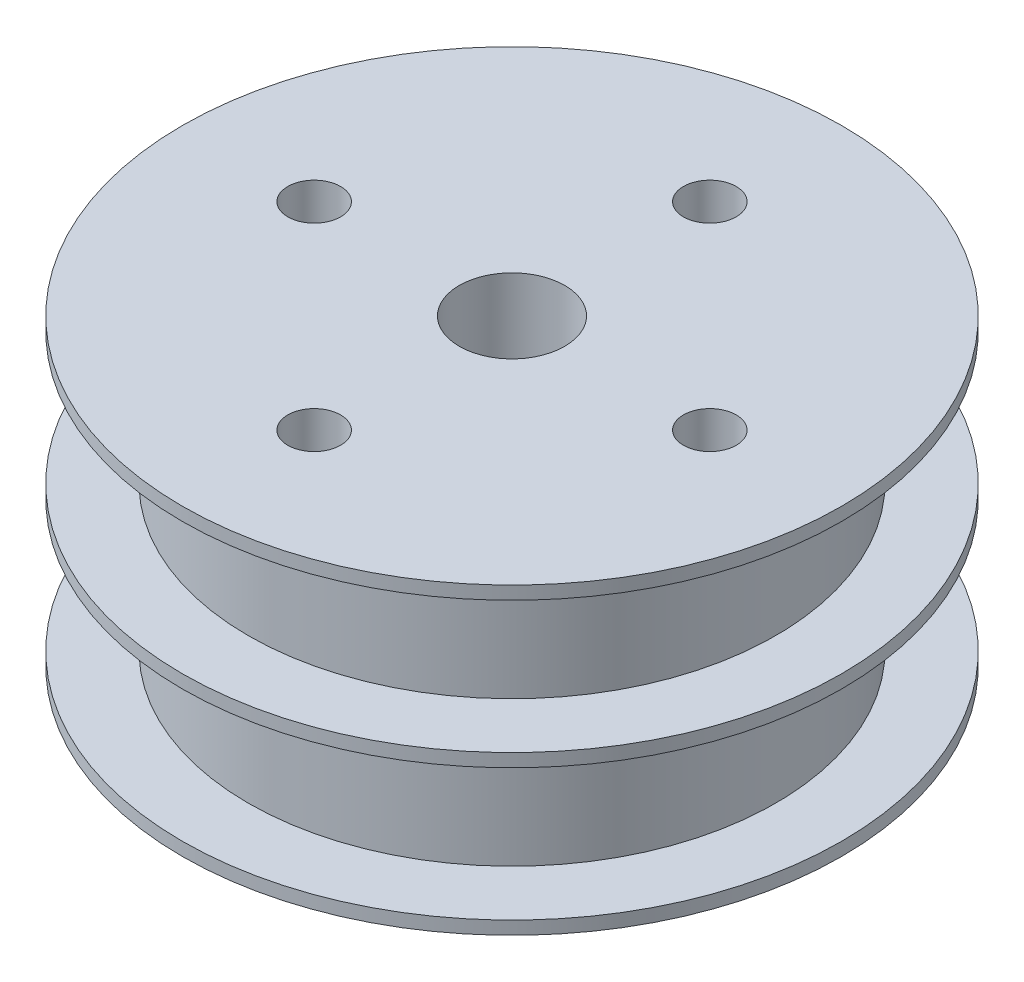
ISO-10303-21;
HEADER;
FILE_DESCRIPTION(('STEP AP214'),'2;1');
FILE_NAME('part.step','',(''),(''),'','','');
FILE_SCHEMA(('AUTOMOTIVE_DESIGN { 1 0 10303 214 1 1 1 1 }'));
ENDSEC;
DATA;
#1=APPLICATION_CONTEXT('core data for automotive mechanical design processes');
#2=APPLICATION_PROTOCOL_DEFINITION('international standard','automotive_design',2000,#1);
#3=PRODUCT_CONTEXT('',#1,'mechanical');
#4=PRODUCT('Part','Part','',(#3));
#5=PRODUCT_RELATED_PRODUCT_CATEGORY('part','',(#4));
#6=PRODUCT_DEFINITION_FORMATION('','',#4);
#7=PRODUCT_DEFINITION_CONTEXT('part definition',#1,'design');
#8=PRODUCT_DEFINITION('design','',#6,#7);
#9=PRODUCT_DEFINITION_SHAPE('','',#8);
#10=(LENGTH_UNIT() NAMED_UNIT(*) SI_UNIT(.MILLI.,.METRE.));
#11=(NAMED_UNIT(*) PLANE_ANGLE_UNIT() SI_UNIT($,.RADIAN.));
#12=(NAMED_UNIT(*) SI_UNIT($,.STERADIAN.) SOLID_ANGLE_UNIT());
#13=UNCERTAINTY_MEASURE_WITH_UNIT(LENGTH_MEASURE(1.E-05),#10,'distance_accuracy_value','');
#14=(GEOMETRIC_REPRESENTATION_CONTEXT(3) GLOBAL_UNCERTAINTY_ASSIGNED_CONTEXT((#13)) GLOBAL_UNIT_ASSIGNED_CONTEXT((#10,
#11,#12)) REPRESENTATION_CONTEXT('',''));
#15=CARTESIAN_POINT('',(0.,0.,0.));
#16=DIRECTION('',(0.,0.,1.));
#17=DIRECTION('',(1.,0.,0.));
#18=AXIS2_PLACEMENT_3D('',#15,#16,#17);
#19=CARTESIAN_POINT('',(0.,-1.,0.));
#20=DIRECTION('',(0.,-1.,0.));
#21=DIRECTION('',(0.,0.,-1.));
#22=AXIS2_PLACEMENT_3D('',#19,#20,#21);
#23=PLANE('',#22);
#24=CARTESIAN_POINT('',(0.,-1.,0.));
#25=DIRECTION('',(0.,-1.,0.));
#26=DIRECTION('',(0.,0.,-1.));
#27=AXIS2_PLACEMENT_3D('',#24,#25,#26);
#28=CIRCLE('',#27,25.);
#29=CARTESIAN_POINT('',(0.,-1.,-25.));
#30=VERTEX_POINT('',#29);
#31=EDGE_CURVE('E138',#30,#30,#28,.T.);
#32=ORIENTED_EDGE('',*,*,#31,.T.);
#33=EDGE_LOOP('',(#32));
#34=FACE_BOUND('',#33,.T.);
#35=CARTESIAN_POINT('',(0.,-1.,0.));
#36=DIRECTION('',(0.,-1.,0.));
#37=DIRECTION('',(0.,0.,-1.));
#38=AXIS2_PLACEMENT_3D('',#35,#36,#37);
#39=CIRCLE('',#38,20.);
#40=CARTESIAN_POINT('',(0.,-1.,-20.));
#41=VERTEX_POINT('',#40);
#42=EDGE_CURVE('E142',#41,#41,#39,.T.);
#43=ORIENTED_EDGE('',*,*,#42,.F.);
#44=EDGE_LOOP('',(#43));
#45=FACE_BOUND('',#44,.T.);
#46=ADVANCED_FACE('F103',(#34,#45),#23,.T.);
#47=CARTESIAN_POINT('',(0.,10.,0.));
#48=DIRECTION('',(0.,-1.,0.));
#49=DIRECTION('',(0.,0.,-1.));
#50=AXIS2_PLACEMENT_3D('',#47,#48,#49);
#51=CYLINDRICAL_SURFACE('',#50,20.);
#52=CARTESIAN_POINT('',(0.,10.,0.));
#53=DIRECTION('',(0.,1.,0.));
#54=DIRECTION('',(0.,0.,1.));
#55=AXIS2_PLACEMENT_3D('',#52,#53,#54);
#56=CIRCLE('',#55,20.);
#57=CARTESIAN_POINT('',(0.,10.,20.));
#58=VERTEX_POINT('',#57);
#59=EDGE_CURVE('E11',#58,#58,#56,.T.);
#60=ORIENTED_EDGE('',*,*,#59,.F.);
#61=EDGE_LOOP('',(#60));
#62=FACE_BOUND('',#61,.T.);
#63=CARTESIAN_POINT('',(0.,0.,0.));
#64=DIRECTION('',(0.,1.,0.));
#65=DIRECTION('',(0.,0.,1.));
#66=AXIS2_PLACEMENT_3D('',#63,#64,#65);
#67=CIRCLE('',#66,20.);
#68=CARTESIAN_POINT('',(0.,0.,20.));
#69=VERTEX_POINT('',#68);
#70=EDGE_CURVE('E107',#69,#69,#67,.T.);
#71=ORIENTED_EDGE('',*,*,#70,.T.);
#72=EDGE_LOOP('',(#71));
#73=FACE_BOUND('',#72,.T.);
#74=ADVANCED_FACE('F105',(#62,#73),#51,.T.);
#75=CARTESIAN_POINT('',(0.,10.,-15.));
#76=DIRECTION('',(0.,-1.,0.));
#77=DIRECTION('',(0.,0.,-1.));
#78=AXIS2_PLACEMENT_3D('',#75,#76,#77);
#79=CYLINDRICAL_SURFACE('',#78,2.);
#80=CARTESIAN_POINT('',(-7.98544339353499E-13,11.,-14.9999999999991));
#81=DIRECTION('',(0.,1.,0.));
#82=DIRECTION('',(0.,0.,1.));
#83=AXIS2_PLACEMENT_3D('',#80,#81,#82);
#84=CIRCLE('',#83,2.);
#85=CARTESIAN_POINT('',(-7.98544339353499E-13,11.,-12.9999999999991));
#86=VERTEX_POINT('',#85);
#87=EDGE_CURVE('E126',#86,#86,#84,.T.);
#88=ORIENTED_EDGE('',*,*,#87,.T.);
#89=EDGE_LOOP('',(#88));
#90=FACE_BOUND('',#89,.T.);
#91=CARTESIAN_POINT('',(-8.59999163707004E-13,-12.,-15.));
#92=DIRECTION('',(0.,-1.,0.));
#93=DIRECTION('',(0.,0.,-1.));
#94=AXIS2_PLACEMENT_3D('',#91,#92,#93);
#95=CIRCLE('',#94,2.);
#96=CARTESIAN_POINT('',(-8.59999163707004E-13,-12.,-17.));
#97=VERTEX_POINT('',#96);
#98=EDGE_CURVE('E162',#97,#97,#95,.T.);
#99=ORIENTED_EDGE('',*,*,#98,.T.);
#100=EDGE_LOOP('',(#99));
#101=FACE_BOUND('',#100,.T.);
#102=ADVANCED_FACE('F195',(#90,#101),#79,.F.);
#103=CARTESIAN_POINT('',(0.,10.,0.));
#104=DIRECTION('',(0.,-1.,0.));
#105=DIRECTION('',(0.,0.,-1.));
#106=AXIS2_PLACEMENT_3D('',#103,#104,#105);
#107=CYLINDRICAL_SURFACE('',#106,4.);
#108=CARTESIAN_POINT('',(0.,11.,0.));
#109=DIRECTION('',(0.,1.,0.));
#110=DIRECTION('',(0.,0.,1.));
#111=AXIS2_PLACEMENT_3D('',#108,#109,#110);
#112=CIRCLE('',#111,4.);
#113=CARTESIAN_POINT('',(0.,11.,4.));
#114=VERTEX_POINT('',#113);
#115=EDGE_CURVE('E119',#114,#114,#112,.T.);
#116=ORIENTED_EDGE('',*,*,#115,.T.);
#117=EDGE_LOOP('',(#116));
#118=FACE_BOUND('',#117,.T.);
#119=CARTESIAN_POINT('',(0.,-12.,0.));
#120=DIRECTION('',(0.,-1.,0.));
#121=DIRECTION('',(0.,0.,-1.));
#122=AXIS2_PLACEMENT_3D('',#119,#120,#121);
#123=CIRCLE('',#122,4.);
#124=CARTESIAN_POINT('',(0.,-12.,-4.));
#125=VERTEX_POINT('',#124);
#126=EDGE_CURVE('E156',#125,#125,#123,.T.);
#127=ORIENTED_EDGE('',*,*,#126,.T.);
#128=EDGE_LOOP('',(#127));
#129=FACE_BOUND('',#128,.T.);
#130=ADVANCED_FACE('F228',(#118,#129),#107,.F.);
#131=CARTESIAN_POINT('',(15.0000000000008,10.,-8.50814312713399E-13));
#132=DIRECTION('',(0.,-1.,0.));
#133=DIRECTION('',(0.,0.,-1.));
#134=AXIS2_PLACEMENT_3D('',#131,#132,#133);
#135=CYLINDRICAL_SURFACE('',#134,2.);
#136=CARTESIAN_POINT('',(14.9999999999991,11.,-7.47906842746832E-13));
#137=DIRECTION('',(0.,1.,0.));
#138=DIRECTION('',(0.,0.,1.));
#139=AXIS2_PLACEMENT_3D('',#136,#137,#138);
#140=CIRCLE('',#139,2.);
#141=CARTESIAN_POINT('',(14.9999999999991,11.,1.99999999999925));
#142=VERTEX_POINT('',#141);
#143=EDGE_CURVE('E129',#142,#142,#140,.T.);
#144=ORIENTED_EDGE('',*,*,#143,.T.);
#145=EDGE_LOOP('',(#144));
#146=FACE_BOUND('',#145,.T.);
#147=CARTESIAN_POINT('',(15.0000000000004,-12.,-1.2808138945669E-12));
#148=DIRECTION('',(0.,-1.,0.));
#149=DIRECTION('',(0.,0.,-1.));
#150=AXIS2_PLACEMENT_3D('',#147,#148,#149);
#151=CIRCLE('',#150,2.);
#152=CARTESIAN_POINT('',(15.0000000000004,-12.,-2.00000000000128));
#153=VERTEX_POINT('',#152);
#154=EDGE_CURVE('E159',#153,#153,#151,.T.);
#155=ORIENTED_EDGE('',*,*,#154,.T.);
#156=EDGE_LOOP('',(#155));
#157=FACE_BOUND('',#156,.T.);
#158=ADVANCED_FACE('F224',(#146,#157),#135,.F.);
#159=CARTESIAN_POINT('',(1.7016286254268E-12,10.,15.));
#160=DIRECTION('',(0.,-1.,0.));
#161=DIRECTION('',(0.,0.,-1.));
#162=AXIS2_PLACEMENT_3D('',#159,#160,#161);
#163=CYLINDRICAL_SURFACE('',#162,2.);
#164=CARTESIAN_POINT('',(6.95534622664188E-13,11.,14.9999999999991));
#165=DIRECTION('',(0.,1.,0.));
#166=DIRECTION('',(0.,0.,1.));
#167=AXIS2_PLACEMENT_3D('',#164,#165,#166);
#168=CIRCLE('',#167,2.);
#169=CARTESIAN_POINT('',(6.95534622664188E-13,11.,16.9999999999991));
#170=VERTEX_POINT('',#169);
#171=EDGE_CURVE('E132',#170,#170,#168,.T.);
#172=ORIENTED_EDGE('',*,*,#171,.T.);
#173=EDGE_LOOP('',(#172));
#174=FACE_BOUND('',#173,.T.);
#175=CARTESIAN_POINT('',(1.7016286254268E-12,-12.,15.));
#176=DIRECTION('',(0.,-1.,0.));
#177=DIRECTION('',(0.,0.,-1.));
#178=AXIS2_PLACEMENT_3D('',#175,#176,#177);
#179=CIRCLE('',#178,2.);
#180=CARTESIAN_POINT('',(1.7016286254268E-12,-12.,13.));
#181=VERTEX_POINT('',#180);
#182=EDGE_CURVE('E151',#181,#181,#179,.T.);
#183=ORIENTED_EDGE('',*,*,#182,.T.);
#184=EDGE_LOOP('',(#183));
#185=FACE_BOUND('',#184,.T.);
#186=ADVANCED_FACE('F220',(#174,#185),#163,.F.);
#187=CARTESIAN_POINT('',(-14.9999999999991,10.,8.5265128291212E-13));
#188=DIRECTION('',(0.,-1.,0.));
#189=DIRECTION('',(0.,0.,-1.));
#190=AXIS2_PLACEMENT_3D('',#187,#188,#189);
#191=CYLINDRICAL_SURFACE('',#190,2.);
#192=CARTESIAN_POINT('',(-14.9999999999991,11.,8.5265128291212E-13));
#193=DIRECTION('',(0.,1.,0.));
#194=DIRECTION('',(0.,0.,1.));
#195=AXIS2_PLACEMENT_3D('',#192,#193,#194);
#196=CIRCLE('',#195,2.);
#197=CARTESIAN_POINT('',(-14.9999999999991,11.,2.00000000000085));
#198=VERTEX_POINT('',#197);
#199=EDGE_CURVE('E123',#198,#198,#196,.T.);
#200=ORIENTED_EDGE('',*,*,#199,.T.);
#201=EDGE_LOOP('',(#200));
#202=FACE_BOUND('',#201,.T.);
#203=CARTESIAN_POINT('',(-14.9999999999996,-12.,1.27897692436818E-12));
#204=DIRECTION('',(0.,-1.,0.));
#205=DIRECTION('',(0.,0.,-1.));
#206=AXIS2_PLACEMENT_3D('',#203,#204,#205);
#207=CIRCLE('',#206,2.);
#208=CARTESIAN_POINT('',(-14.9999999999996,-12.,-1.99999999999872));
#209=VERTEX_POINT('',#208);
#210=EDGE_CURVE('E165',#209,#209,#207,.T.);
#211=ORIENTED_EDGE('',*,*,#210,.T.);
#212=EDGE_LOOP('',(#211));
#213=FACE_BOUND('',#212,.T.);
#214=ADVANCED_FACE('F169',(#202,#213),#191,.F.);
#215=CARTESIAN_POINT('',(0.,11.,0.));
#216=DIRECTION('',(0.,1.,0.));
#217=DIRECTION('',(0.,0.,1.));
#218=AXIS2_PLACEMENT_3D('',#215,#216,#217);
#219=PLANE('',#218);
#220=ORIENTED_EDGE('',*,*,#143,.F.);
#221=EDGE_LOOP('',(#220));
#222=FACE_BOUND('',#221,.T.);
#223=ORIENTED_EDGE('',*,*,#199,.F.);
#224=EDGE_LOOP('',(#223));
#225=FACE_BOUND('',#224,.T.);
#226=CARTESIAN_POINT('',(0.,11.,0.));
#227=DIRECTION('',(0.,1.,0.));
#228=DIRECTION('',(0.,0.,1.));
#229=AXIS2_PLACEMENT_3D('',#226,#227,#228);
#230=CIRCLE('',#229,25.);
#231=CARTESIAN_POINT('',(0.,11.,25.));
#232=VERTEX_POINT('',#231);
#233=EDGE_CURVE('E111',#232,#232,#230,.T.);
#234=ORIENTED_EDGE('',*,*,#233,.T.);
#235=EDGE_LOOP('',(#234));
#236=FACE_BOUND('',#235,.T.);
#237=ORIENTED_EDGE('',*,*,#115,.F.);
#238=EDGE_LOOP('',(#237));
#239=FACE_BOUND('',#238,.T.);
#240=ORIENTED_EDGE('',*,*,#87,.F.);
#241=EDGE_LOOP('',(#240));
#242=FACE_BOUND('',#241,.T.);
#243=ORIENTED_EDGE('',*,*,#171,.F.);
#244=EDGE_LOOP('',(#243));
#245=FACE_BOUND('',#244,.T.);
#246=ADVANCED_FACE('F208',(#222,#225,#236,#239,#242,#245),#219,.T.);
#247=CARTESIAN_POINT('',(0.,10.,0.));
#248=DIRECTION('',(0.,1.,0.));
#249=DIRECTION('',(0.,0.,1.));
#250=AXIS2_PLACEMENT_3D('',#247,#248,#249);
#251=PLANE('',#250);
#252=ORIENTED_EDGE('',*,*,#59,.T.);
#253=EDGE_LOOP('',(#252));
#254=FACE_BOUND('',#253,.T.);
#255=CARTESIAN_POINT('',(0.,10.,0.));
#256=DIRECTION('',(0.,1.,0.));
#257=DIRECTION('',(0.,0.,1.));
#258=AXIS2_PLACEMENT_3D('',#255,#256,#257);
#259=CIRCLE('',#258,25.);
#260=CARTESIAN_POINT('',(0.,10.,25.));
#261=VERTEX_POINT('',#260);
#262=EDGE_CURVE('E115',#261,#261,#259,.T.);
#263=ORIENTED_EDGE('',*,*,#262,.F.);
#264=EDGE_LOOP('',(#263));
#265=FACE_BOUND('',#264,.T.);
#266=ADVANCED_FACE('F211',(#254,#265),#251,.F.);
#267=CARTESIAN_POINT('',(0.,11.,0.));
#268=DIRECTION('',(0.,-1.,0.));
#269=DIRECTION('',(0.,0.,-1.));
#270=AXIS2_PLACEMENT_3D('',#267,#268,#269);
#271=CYLINDRICAL_SURFACE('',#270,25.);
#272=ORIENTED_EDGE('',*,*,#233,.F.);
#273=EDGE_LOOP('',(#272));
#274=FACE_BOUND('',#273,.T.);
#275=ORIENTED_EDGE('',*,*,#262,.T.);
#276=EDGE_LOOP('',(#275));
#277=FACE_BOUND('',#276,.T.);
#278=ADVANCED_FACE('F203',(#274,#277),#271,.T.);
#279=CARTESIAN_POINT('',(0.,0.,0.));
#280=DIRECTION('',(0.,-1.,0.));
#281=DIRECTION('',(0.,0.,-1.));
#282=AXIS2_PLACEMENT_3D('',#279,#280,#281);
#283=PLANE('',#282);
#284=ORIENTED_EDGE('',*,*,#70,.F.);
#285=EDGE_LOOP('',(#284));
#286=FACE_BOUND('',#285,.T.);
#287=CARTESIAN_POINT('',(0.,0.,0.));
#288=DIRECTION('',(0.,-1.,0.));
#289=DIRECTION('',(0.,0.,-1.));
#290=AXIS2_PLACEMENT_3D('',#287,#288,#289);
#291=CIRCLE('',#290,25.);
#292=CARTESIAN_POINT('',(0.,0.,-25.));
#293=VERTEX_POINT('',#292);
#294=EDGE_CURVE('E135',#293,#293,#291,.T.);
#295=ORIENTED_EDGE('',*,*,#294,.F.);
#296=EDGE_LOOP('',(#295));
#297=FACE_BOUND('',#296,.T.);
#298=ADVANCED_FACE('F200',(#286,#297),#283,.F.);
#299=CARTESIAN_POINT('',(0.,-1.,0.));
#300=DIRECTION('',(0.,1.,0.));
#301=DIRECTION('',(0.,0.,1.));
#302=AXIS2_PLACEMENT_3D('',#299,#300,#301);
#303=CYLINDRICAL_SURFACE('',#302,25.);
#304=ORIENTED_EDGE('',*,*,#31,.F.);
#305=EDGE_LOOP('',(#304));
#306=FACE_BOUND('',#305,.T.);
#307=ORIENTED_EDGE('',*,*,#294,.T.);
#308=EDGE_LOOP('',(#307));
#309=FACE_BOUND('',#308,.T.);
#310=ADVANCED_FACE('F184',(#306,#309),#303,.T.);
#311=CARTESIAN_POINT('',(0.,-11.,0.));
#312=DIRECTION('',(0.,1.,0.));
#313=DIRECTION('',(0.,0.,1.));
#314=AXIS2_PLACEMENT_3D('',#311,#312,#313);
#315=CYLINDRICAL_SURFACE('',#314,20.);
#316=CARTESIAN_POINT('',(0.,-11.,0.));
#317=DIRECTION('',(0.,-1.,0.));
#318=DIRECTION('',(0.,0.,-1.));
#319=AXIS2_PLACEMENT_3D('',#316,#317,#318);
#320=CIRCLE('',#319,20.);
#321=CARTESIAN_POINT('',(0.,-11.,-20.));
#322=VERTEX_POINT('',#321);
#323=EDGE_CURVE('E139',#322,#322,#320,.T.);
#324=ORIENTED_EDGE('',*,*,#323,.F.);
#325=EDGE_LOOP('',(#324));
#326=FACE_BOUND('',#325,.T.);
#327=ORIENTED_EDGE('',*,*,#42,.T.);
#328=EDGE_LOOP('',(#327));
#329=FACE_BOUND('',#328,.T.);
#330=ADVANCED_FACE('F174',(#326,#329),#315,.T.);
#331=CARTESIAN_POINT('',(0.,-12.,0.));
#332=DIRECTION('',(0.,-1.,0.));
#333=DIRECTION('',(0.,0.,-1.));
#334=AXIS2_PLACEMENT_3D('',#331,#332,#333);
#335=PLANE('',#334);
#336=ORIENTED_EDGE('',*,*,#98,.F.);
#337=EDGE_LOOP('',(#336));
#338=FACE_BOUND('',#337,.T.);
#339=ORIENTED_EDGE('',*,*,#126,.F.);
#340=EDGE_LOOP('',(#339));
#341=FACE_BOUND('',#340,.T.);
#342=CARTESIAN_POINT('',(0.,-12.,0.));
#343=DIRECTION('',(0.,-1.,0.));
#344=DIRECTION('',(0.,0.,-1.));
#345=AXIS2_PLACEMENT_3D('',#342,#343,#344);
#346=CIRCLE('',#345,25.);
#347=CARTESIAN_POINT('',(0.,-12.,-25.));
#348=VERTEX_POINT('',#347);
#349=EDGE_CURVE('E145',#348,#348,#346,.T.);
#350=ORIENTED_EDGE('',*,*,#349,.T.);
#351=EDGE_LOOP('',(#350));
#352=FACE_BOUND('',#351,.T.);
#353=ORIENTED_EDGE('',*,*,#182,.F.);
#354=EDGE_LOOP('',(#353));
#355=FACE_BOUND('',#354,.T.);
#356=ORIENTED_EDGE('',*,*,#154,.F.);
#357=EDGE_LOOP('',(#356));
#358=FACE_BOUND('',#357,.T.);
#359=ORIENTED_EDGE('',*,*,#210,.F.);
#360=EDGE_LOOP('',(#359));
#361=FACE_BOUND('',#360,.T.);
#362=ADVANCED_FACE('F171',(#338,#341,#352,#355,#358,#361),#335,.T.);
#363=CARTESIAN_POINT('',(0.,-11.,0.));
#364=DIRECTION('',(0.,-1.,0.));
#365=DIRECTION('',(0.,0.,-1.));
#366=AXIS2_PLACEMENT_3D('',#363,#364,#365);
#367=PLANE('',#366);
#368=ORIENTED_EDGE('',*,*,#323,.T.);
#369=EDGE_LOOP('',(#368));
#370=FACE_BOUND('',#369,.T.);
#371=CARTESIAN_POINT('',(0.,-11.,0.));
#372=DIRECTION('',(0.,-1.,0.));
#373=DIRECTION('',(0.,0.,-1.));
#374=AXIS2_PLACEMENT_3D('',#371,#372,#373);
#375=CIRCLE('',#374,25.);
#376=CARTESIAN_POINT('',(0.,-11.,-25.));
#377=VERTEX_POINT('',#376);
#378=EDGE_CURVE('E148',#377,#377,#375,.T.);
#379=ORIENTED_EDGE('',*,*,#378,.F.);
#380=EDGE_LOOP('',(#379));
#381=FACE_BOUND('',#380,.T.);
#382=ADVANCED_FACE('F173',(#370,#381),#367,.F.);
#383=CARTESIAN_POINT('',(0.,-12.,0.));
#384=DIRECTION('',(0.,1.,0.));
#385=DIRECTION('',(0.,0.,1.));
#386=AXIS2_PLACEMENT_3D('',#383,#384,#385);
#387=CYLINDRICAL_SURFACE('',#386,25.);
#388=ORIENTED_EDGE('',*,*,#349,.F.);
#389=EDGE_LOOP('',(#388));
#390=FACE_BOUND('',#389,.T.);
#391=ORIENTED_EDGE('',*,*,#378,.T.);
#392=EDGE_LOOP('',(#391));
#393=FACE_BOUND('',#392,.T.);
#394=ADVANCED_FACE('F181',(#390,#393),#387,.T.);
#395=CLOSED_SHELL('',(#46,#74,#102,#130,#158,#186,#214,#246,#266,#278,#298,#310,#330,#362,#382,#394));
#396=MANIFOLD_SOLID_BREP('B2',#395);
#397=ADVANCED_BREP_SHAPE_REPRESENTATION('',(#18,#396),#14);
#398=SHAPE_DEFINITION_REPRESENTATION(#9,#397);
ENDSEC;
END-ISO-10303-21;
